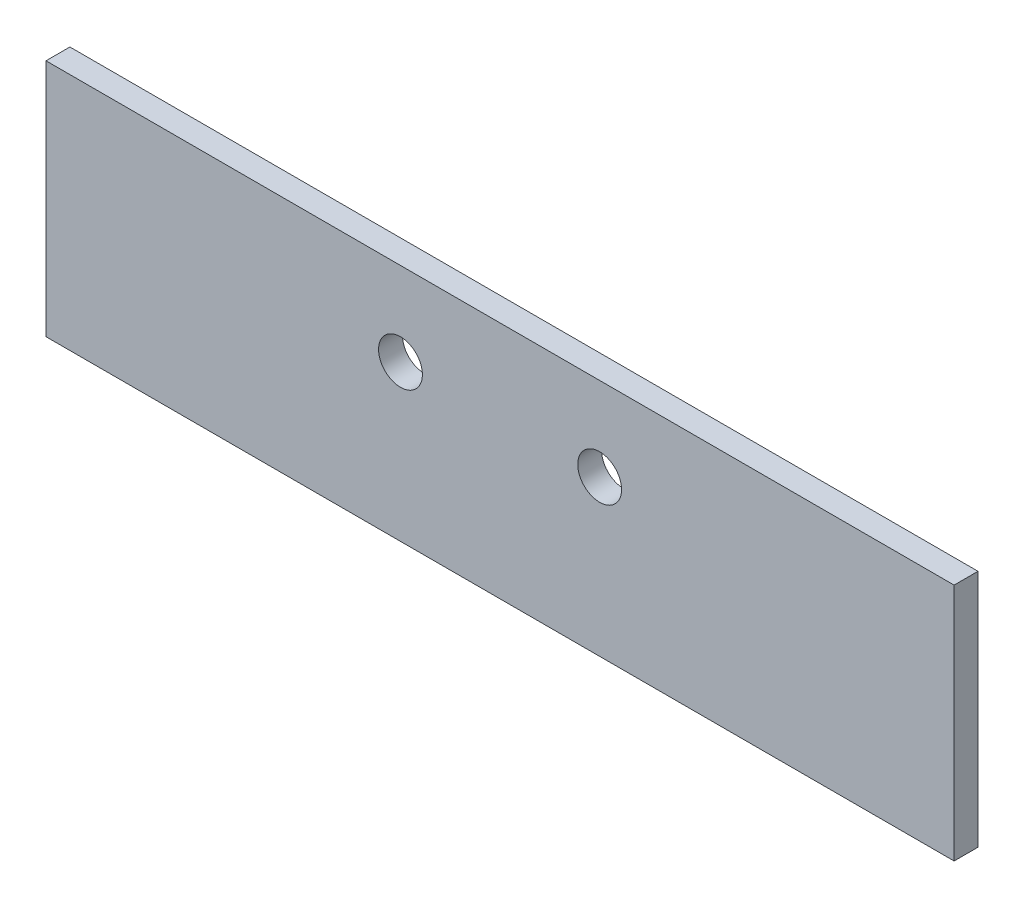
ISO-10303-21;
HEADER;
FILE_DESCRIPTION(('STEP AP214'),'2;1');
FILE_NAME('part.step','',(''),(''),'','','');
FILE_SCHEMA(('AUTOMOTIVE_DESIGN { 1 0 10303 214 1 1 1 1 }'));
ENDSEC;
DATA;
#1=APPLICATION_CONTEXT('core data for automotive mechanical design processes');
#2=APPLICATION_PROTOCOL_DEFINITION('international standard','automotive_design',2000,#1);
#3=PRODUCT_CONTEXT('',#1,'mechanical');
#4=PRODUCT('Part','Part','',(#3));
#5=PRODUCT_RELATED_PRODUCT_CATEGORY('part','',(#4));
#6=PRODUCT_DEFINITION_FORMATION('','',#4);
#7=PRODUCT_DEFINITION_CONTEXT('part definition',#1,'design');
#8=PRODUCT_DEFINITION('design','',#6,#7);
#9=PRODUCT_DEFINITION_SHAPE('','',#8);
#10=(LENGTH_UNIT() NAMED_UNIT(*) SI_UNIT(.MILLI.,.METRE.));
#11=(NAMED_UNIT(*) PLANE_ANGLE_UNIT() SI_UNIT($,.RADIAN.));
#12=(NAMED_UNIT(*) SI_UNIT($,.STERADIAN.) SOLID_ANGLE_UNIT());
#13=UNCERTAINTY_MEASURE_WITH_UNIT(LENGTH_MEASURE(1.E-05),#10,'distance_accuracy_value','');
#14=(GEOMETRIC_REPRESENTATION_CONTEXT(3) GLOBAL_UNCERTAINTY_ASSIGNED_CONTEXT((#13)) GLOBAL_UNIT_ASSIGNED_CONTEXT((#10,
#11,#12)) REPRESENTATION_CONTEXT('',''));
#15=CARTESIAN_POINT('',(0.,0.,0.));
#16=DIRECTION('',(0.,0.,1.));
#17=DIRECTION('',(1.,0.,0.));
#18=AXIS2_PLACEMENT_3D('',#15,#16,#17);
#19=CARTESIAN_POINT('',(-57.,15.,1.5));
#20=DIRECTION('',(1.,0.,0.));
#21=DIRECTION('',(0.,1.,0.));
#22=AXIS2_PLACEMENT_3D('',#19,#20,#21);
#23=PLANE('',#22);
#24=DIRECTION('',(0.,-1.,0.));
#25=VECTOR('',#24,1.);
#26=CARTESIAN_POINT('',(-57.,15.,-1.5));
#27=LINE('',#26,#25);
#28=CARTESIAN_POINT('',(-57.,15.,-1.5));
#29=VERTEX_POINT('',#28);
#30=CARTESIAN_POINT('',(-57.,-15.,-1.5));
#31=VERTEX_POINT('',#30);
#32=EDGE_CURVE('E109',#29,#31,#27,.T.);
#33=ORIENTED_EDGE('',*,*,#32,.T.);
#34=DIRECTION('',(0.,0.,-1.));
#35=VECTOR('',#34,1.);
#36=CARTESIAN_POINT('',(-57.,-15.,1.5));
#37=LINE('',#36,#35);
#38=CARTESIAN_POINT('',(-57.,-15.,1.5));
#39=VERTEX_POINT('',#38);
#40=EDGE_CURVE('E11',#39,#31,#37,.T.);
#41=ORIENTED_EDGE('',*,*,#40,.F.);
#42=DIRECTION('',(0.,-1.,0.));
#43=VECTOR('',#42,1.);
#44=CARTESIAN_POINT('',(-57.,15.,1.5));
#45=LINE('',#44,#43);
#46=CARTESIAN_POINT('',(-57.,15.,1.5));
#47=VERTEX_POINT('',#46);
#48=EDGE_CURVE('E91',#47,#39,#45,.T.);
#49=ORIENTED_EDGE('',*,*,#48,.F.);
#50=DIRECTION('',(0.,0.,-1.));
#51=VECTOR('',#50,1.);
#52=CARTESIAN_POINT('',(-57.,15.,1.5));
#53=LINE('',#52,#51);
#54=EDGE_CURVE('E106',#47,#29,#53,.T.);
#55=ORIENTED_EDGE('',*,*,#54,.T.);
#56=EDGE_LOOP('',(#33,#41,#49,#55));
#57=FACE_BOUND('',#56,.T.);
#58=ADVANCED_FACE('F41',(#57),#23,.F.);
#59=CARTESIAN_POINT('',(57.,-15.,1.5));
#60=DIRECTION('',(0.,1.,0.));
#61=DIRECTION('',(-1.,0.,0.));
#62=AXIS2_PLACEMENT_3D('',#59,#60,#61);
#63=PLANE('',#62);
#64=DIRECTION('',(1.,0.,0.));
#65=VECTOR('',#64,1.);
#66=CARTESIAN_POINT('',(57.,-15.,-1.5));
#67=LINE('',#66,#65);
#68=CARTESIAN_POINT('',(57.,-15.,-1.5));
#69=VERTEX_POINT('',#68);
#70=EDGE_CURVE('E98',#31,#69,#67,.T.);
#71=ORIENTED_EDGE('',*,*,#70,.T.);
#72=DIRECTION('',(0.,0.,-1.));
#73=VECTOR('',#72,1.);
#74=CARTESIAN_POINT('',(57.,-15.,1.5));
#75=LINE('',#74,#73);
#76=CARTESIAN_POINT('',(57.,-15.,1.5));
#77=VERTEX_POINT('',#76);
#78=EDGE_CURVE('E49',#77,#69,#75,.T.);
#79=ORIENTED_EDGE('',*,*,#78,.F.);
#80=DIRECTION('',(1.,0.,0.));
#81=VECTOR('',#80,1.);
#82=CARTESIAN_POINT('',(57.,-15.,1.5));
#83=LINE('',#82,#81);
#84=EDGE_CURVE('E86',#39,#77,#83,.T.);
#85=ORIENTED_EDGE('',*,*,#84,.F.);
#86=ORIENTED_EDGE('',*,*,#40,.T.);
#87=EDGE_LOOP('',(#71,#79,#85,#86));
#88=FACE_BOUND('',#87,.T.);
#89=ADVANCED_FACE('F100',(#88),#63,.F.);
#90=CARTESIAN_POINT('',(57.,15.,1.5));
#91=DIRECTION('',(-1.,0.,0.));
#92=DIRECTION('',(0.,-1.,0.));
#93=AXIS2_PLACEMENT_3D('',#90,#91,#92);
#94=PLANE('',#93);
#95=DIRECTION('',(0.,1.,0.));
#96=VECTOR('',#95,1.);
#97=CARTESIAN_POINT('',(57.,15.,-1.5));
#98=LINE('',#97,#96);
#99=CARTESIAN_POINT('',(57.,15.,-1.5));
#100=VERTEX_POINT('',#99);
#101=EDGE_CURVE('E73',#69,#100,#98,.T.);
#102=ORIENTED_EDGE('',*,*,#101,.T.);
#103=DIRECTION('',(0.,0.,-1.));
#104=VECTOR('',#103,1.);
#105=CARTESIAN_POINT('',(57.,15.,1.5));
#106=LINE('',#105,#104);
#107=CARTESIAN_POINT('',(57.,15.,1.5));
#108=VERTEX_POINT('',#107);
#109=EDGE_CURVE('E99',#108,#100,#106,.T.);
#110=ORIENTED_EDGE('',*,*,#109,.F.);
#111=DIRECTION('',(0.,1.,0.));
#112=VECTOR('',#111,1.);
#113=CARTESIAN_POINT('',(57.,15.,1.5));
#114=LINE('',#113,#112);
#115=EDGE_CURVE('E93',#77,#108,#114,.T.);
#116=ORIENTED_EDGE('',*,*,#115,.F.);
#117=ORIENTED_EDGE('',*,*,#78,.T.);
#118=EDGE_LOOP('',(#102,#110,#116,#117));
#119=FACE_BOUND('',#118,.T.);
#120=ADVANCED_FACE('F101',(#119),#94,.F.);
#121=CARTESIAN_POINT('',(57.,15.,1.5));
#122=DIRECTION('',(0.,-1.,0.));
#123=DIRECTION('',(1.,0.,0.));
#124=AXIS2_PLACEMENT_3D('',#121,#122,#123);
#125=PLANE('',#124);
#126=DIRECTION('',(-1.,0.,0.));
#127=VECTOR('',#126,1.);
#128=CARTESIAN_POINT('',(57.,15.,-1.5));
#129=LINE('',#128,#127);
#130=EDGE_CURVE('E82',#100,#29,#129,.T.);
#131=ORIENTED_EDGE('',*,*,#130,.T.);
#132=ORIENTED_EDGE('',*,*,#54,.F.);
#133=DIRECTION('',(-1.,0.,0.));
#134=VECTOR('',#133,1.);
#135=CARTESIAN_POINT('',(57.,15.,1.5));
#136=LINE('',#135,#134);
#137=EDGE_CURVE('E59',#108,#47,#136,.T.);
#138=ORIENTED_EDGE('',*,*,#137,.F.);
#139=ORIENTED_EDGE('',*,*,#109,.T.);
#140=EDGE_LOOP('',(#131,#132,#138,#139));
#141=FACE_BOUND('',#140,.T.);
#142=ADVANCED_FACE('F123',(#141),#125,.F.);
#143=CARTESIAN_POINT('',(0.,0.,1.5));
#144=DIRECTION('',(0.,0.,-1.));
#145=DIRECTION('',(-1.,0.,0.));
#146=AXIS2_PLACEMENT_3D('',#143,#144,#145);
#147=PLANE('',#146);
#148=CARTESIAN_POINT('',(12.5,4.50000000000001,1.5));
#149=DIRECTION('',(0.,0.,1.));
#150=DIRECTION('',(1.,0.,0.));
#151=AXIS2_PLACEMENT_3D('',#148,#149,#150);
#152=CIRCLE('',#151,2.75);
#153=CARTESIAN_POINT('',(15.25,4.50000000000001,1.5));
#154=VERTEX_POINT('',#153);
#155=EDGE_CURVE('E145',#154,#154,#152,.T.);
#156=ORIENTED_EDGE('',*,*,#155,.F.);
#157=EDGE_LOOP('',(#156));
#158=FACE_BOUND('',#157,.T.);
#159=CARTESIAN_POINT('',(-12.5,4.50000000000001,1.5));
#160=DIRECTION('',(0.,0.,1.));
#161=DIRECTION('',(1.,0.,0.));
#162=AXIS2_PLACEMENT_3D('',#159,#160,#161);
#163=CIRCLE('',#162,2.75);
#164=CARTESIAN_POINT('',(-9.75,4.50000000000001,1.5));
#165=VERTEX_POINT('',#164);
#166=EDGE_CURVE('E137',#165,#165,#163,.T.);
#167=ORIENTED_EDGE('',*,*,#166,.F.);
#168=EDGE_LOOP('',(#167));
#169=FACE_BOUND('',#168,.T.);
#170=ORIENTED_EDGE('',*,*,#48,.T.);
#171=ORIENTED_EDGE('',*,*,#84,.T.);
#172=ORIENTED_EDGE('',*,*,#115,.T.);
#173=ORIENTED_EDGE('',*,*,#137,.T.);
#174=EDGE_LOOP('',(#170,#171,#172,#173));
#175=FACE_BOUND('',#174,.T.);
#176=ADVANCED_FACE('F90',(#158,#169,#175),#147,.F.);
#177=CARTESIAN_POINT('',(0.,0.,-1.5));
#178=DIRECTION('',(0.,0.,-1.));
#179=DIRECTION('',(-1.,0.,0.));
#180=AXIS2_PLACEMENT_3D('',#177,#178,#179);
#181=PLANE('',#180);
#182=CARTESIAN_POINT('',(12.5,4.50000000000001,-1.5));
#183=DIRECTION('',(0.,0.,1.));
#184=DIRECTION('',(1.,0.,0.));
#185=AXIS2_PLACEMENT_3D('',#182,#183,#184);
#186=CIRCLE('',#185,2.75);
#187=CARTESIAN_POINT('',(15.25,4.50000000000001,-1.5));
#188=VERTEX_POINT('',#187);
#189=EDGE_CURVE('E138',#188,#188,#186,.T.);
#190=ORIENTED_EDGE('',*,*,#189,.T.);
#191=EDGE_LOOP('',(#190));
#192=FACE_BOUND('',#191,.T.);
#193=CARTESIAN_POINT('',(-12.5,4.50000000000001,-1.5));
#194=DIRECTION('',(0.,0.,1.));
#195=DIRECTION('',(1.,0.,0.));
#196=AXIS2_PLACEMENT_3D('',#193,#194,#195);
#197=CIRCLE('',#196,2.75);
#198=CARTESIAN_POINT('',(-9.75,4.50000000000001,-1.5));
#199=VERTEX_POINT('',#198);
#200=EDGE_CURVE('E111',#199,#199,#197,.T.);
#201=ORIENTED_EDGE('',*,*,#200,.T.);
#202=EDGE_LOOP('',(#201));
#203=FACE_BOUND('',#202,.T.);
#204=ORIENTED_EDGE('',*,*,#32,.F.);
#205=ORIENTED_EDGE('',*,*,#130,.F.);
#206=ORIENTED_EDGE('',*,*,#101,.F.);
#207=ORIENTED_EDGE('',*,*,#70,.F.);
#208=EDGE_LOOP('',(#204,#205,#206,#207));
#209=FACE_BOUND('',#208,.T.);
#210=ADVANCED_FACE('F126',(#192,#203,#209),#181,.T.);
#211=CARTESIAN_POINT('',(-12.5,4.50000000000001,1.5));
#212=DIRECTION('',(0.,0.,1.));
#213=DIRECTION('',(1.,0.,0.));
#214=AXIS2_PLACEMENT_3D('',#211,#212,#213);
#215=CYLINDRICAL_SURFACE('',#214,2.75);
#216=ORIENTED_EDGE('',*,*,#200,.F.);
#217=EDGE_LOOP('',(#216));
#218=FACE_BOUND('',#217,.T.);
#219=ORIENTED_EDGE('',*,*,#166,.T.);
#220=EDGE_LOOP('',(#219));
#221=FACE_BOUND('',#220,.T.);
#222=ADVANCED_FACE('F160',(#218,#221),#215,.F.);
#223=CARTESIAN_POINT('',(12.5,4.50000000000001,1.5));
#224=DIRECTION('',(0.,0.,1.));
#225=DIRECTION('',(1.,0.,0.));
#226=AXIS2_PLACEMENT_3D('',#223,#224,#225);
#227=CYLINDRICAL_SURFACE('',#226,2.75);
#228=ORIENTED_EDGE('',*,*,#189,.F.);
#229=EDGE_LOOP('',(#228));
#230=FACE_BOUND('',#229,.T.);
#231=ORIENTED_EDGE('',*,*,#155,.T.);
#232=EDGE_LOOP('',(#231));
#233=FACE_BOUND('',#232,.T.);
#234=ADVANCED_FACE('F147',(#230,#233),#227,.F.);
#235=CLOSED_SHELL('',(#58,#89,#120,#142,#176,#210,#222,#234));
#236=MANIFOLD_SOLID_BREP('B2',#235);
#237=ADVANCED_BREP_SHAPE_REPRESENTATION('',(#18,#236),#14);
#238=SHAPE_DEFINITION_REPRESENTATION(#9,#237);
ENDSEC;
END-ISO-10303-21;
